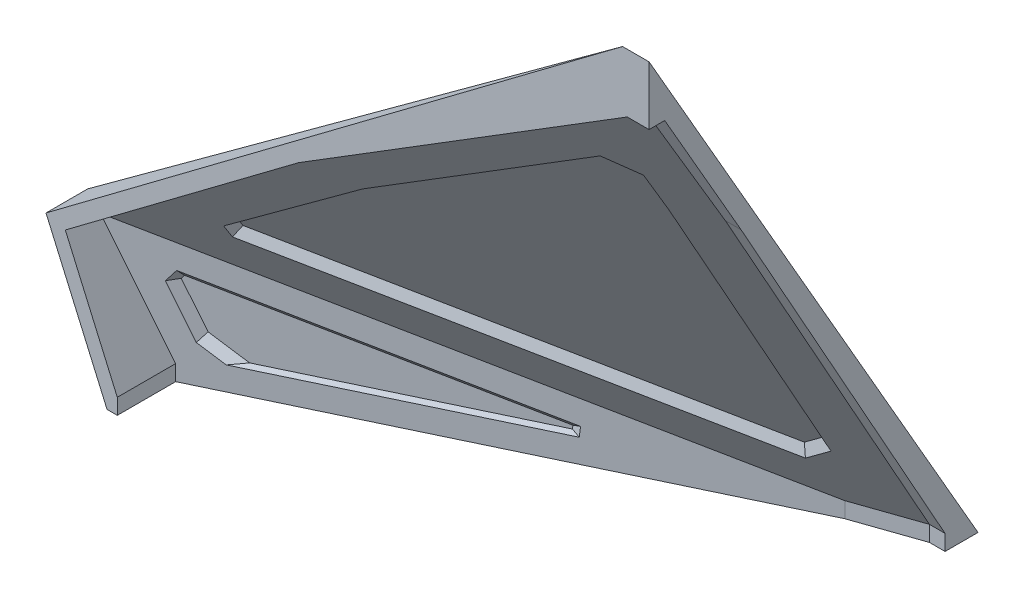
ISO-10303-21;
HEADER;
FILE_DESCRIPTION(('STEP AP214'),'2;1');
FILE_NAME('part.step','',(''),(''),'','','');
FILE_SCHEMA(('AUTOMOTIVE_DESIGN { 1 0 10303 214 1 1 1 1 }'));
ENDSEC;
DATA;
#1=APPLICATION_CONTEXT('core data for automotive mechanical design processes');
#2=APPLICATION_PROTOCOL_DEFINITION('international standard','automotive_design',2000,#1);
#3=PRODUCT_CONTEXT('',#1,'mechanical');
#4=PRODUCT('Part','Part','',(#3));
#5=PRODUCT_RELATED_PRODUCT_CATEGORY('part','',(#4));
#6=PRODUCT_DEFINITION_FORMATION('','',#4);
#7=PRODUCT_DEFINITION_CONTEXT('part definition',#1,'design');
#8=PRODUCT_DEFINITION('design','',#6,#7);
#9=PRODUCT_DEFINITION_SHAPE('','',#8);
#10=(LENGTH_UNIT() NAMED_UNIT(*) SI_UNIT(.MILLI.,.METRE.));
#11=(NAMED_UNIT(*) PLANE_ANGLE_UNIT() SI_UNIT($,.RADIAN.));
#12=(NAMED_UNIT(*) SI_UNIT($,.STERADIAN.) SOLID_ANGLE_UNIT());
#13=UNCERTAINTY_MEASURE_WITH_UNIT(LENGTH_MEASURE(1.E-05),#10,'distance_accuracy_value','');
#14=(GEOMETRIC_REPRESENTATION_CONTEXT(3) GLOBAL_UNCERTAINTY_ASSIGNED_CONTEXT((#13)) GLOBAL_UNIT_ASSIGNED_CONTEXT((#10,
#11,#12)) REPRESENTATION_CONTEXT('',''));
#15=CARTESIAN_POINT('',(0.,0.,0.));
#16=DIRECTION('',(0.,0.,1.));
#17=DIRECTION('',(1.,0.,0.));
#18=AXIS2_PLACEMENT_3D('',#15,#16,#17);
#19=CARTESIAN_POINT('',(-400.,0.,220.));
#20=DIRECTION('',(0.,1.,0.));
#21=DIRECTION('',(0.,0.,1.));
#22=AXIS2_PLACEMENT_3D('',#19,#20,#21);
#23=PLANE('',#22);
#24=DIRECTION('',(-0.90286051882393,0.,0.429933580392348));
#25=VECTOR('',#24,1.);
#26=CARTESIAN_POINT('',(-50.0889353936225,0.,44.9277819489755));
#27=LINE('',#26,#25);
#28=CARTESIAN_POINT('',(-50.0889353936225,0.,44.9277819489755));
#29=VERTEX_POINT('',#28);
#30=CARTESIAN_POINT('',(-339.485119824219,0.,182.735488820688));
#31=VERTEX_POINT('',#30);
#32=EDGE_CURVE('E411',#29,#31,#27,.T.);
#33=ORIENTED_EDGE('',*,*,#32,.T.);
#34=DIRECTION('',(0.,0.,1.));
#35=VECTOR('',#34,1.);
#36=CARTESIAN_POINT('',(-339.485119824219,0.,210.));
#37=LINE('',#36,#35);
#38=CARTESIAN_POINT('',(-339.485119824219,0.,220.));
#39=VERTEX_POINT('',#38);
#40=EDGE_CURVE('E388',#31,#39,#37,.T.);
#41=ORIENTED_EDGE('',*,*,#40,.T.);
#42=DIRECTION('',(1.,0.,0.));
#43=VECTOR('',#42,1.);
#44=CARTESIAN_POINT('',(-400.,0.,220.));
#45=LINE('',#44,#43);
#46=CARTESIAN_POINT('',(-346.027322404372,0.,220.));
#47=VERTEX_POINT('',#46);
#48=EDGE_CURVE('E341',#47,#39,#45,.T.);
#49=ORIENTED_EDGE('',*,*,#48,.F.);
#50=DIRECTION('',(0.,0.,-1.));
#51=VECTOR('',#50,1.);
#52=CARTESIAN_POINT('',(-346.027322404372,0.,220.));
#53=LINE('',#52,#51);
#54=CARTESIAN_POINT('',(-346.027322404372,0.,174.774915430653));
#55=VERTEX_POINT('',#54);
#56=EDGE_CURVE('E350',#47,#55,#53,.T.);
#57=ORIENTED_EDGE('',*,*,#56,.T.);
#58=DIRECTION('',(-0.90286051882393,0.,0.429933580392348));
#59=VECTOR('',#58,1.);
#60=CARTESIAN_POINT('',(0.,0.,10.));
#61=LINE('',#60,#59);
#62=CARTESIAN_POINT('',(0.,0.,10.));
#63=VERTEX_POINT('',#62);
#64=EDGE_CURVE('E347',#63,#55,#61,.T.);
#65=ORIENTED_EDGE('',*,*,#64,.F.);
#66=DIRECTION('',(0.,0.,-1.));
#67=VECTOR('',#66,1.);
#68=CARTESIAN_POINT('',(0.,0.,220.));
#69=LINE('',#68,#67);
#70=CARTESIAN_POINT('',(0.,0.,31.0264548673624));
#71=VERTEX_POINT('',#70);
#72=EDGE_CURVE('E334',#71,#63,#69,.T.);
#73=ORIENTED_EDGE('',*,*,#72,.F.);
#74=DIRECTION('',(1.,0.,0.));
#75=VECTOR('',#74,1.);
#76=CARTESIAN_POINT('',(-10.,0.,31.0264548673624));
#77=LINE('',#76,#75);
#78=CARTESIAN_POINT('',(-10.,0.,31.0264548673624));
#79=VERTEX_POINT('',#78);
#80=EDGE_CURVE('E368',#79,#71,#77,.T.);
#81=ORIENTED_EDGE('',*,*,#80,.F.);
#82=DIRECTION('',(-0.944808264227923,0.,0.327623784006318));
#83=VECTOR('',#82,1.);
#84=CARTESIAN_POINT('',(-10.,0.,31.0264548673624));
#85=LINE('',#84,#83);
#86=EDGE_CURVE('E415',#79,#29,#85,.T.);
#87=ORIENTED_EDGE('',*,*,#86,.T.);
#88=EDGE_LOOP('',(#33,#41,#49,#57,#65,#73,#81,#87));
#89=FACE_BOUND('',#88,.T.);
#90=ADVANCED_FACE('F33',(#89),#23,.F.);
#91=CARTESIAN_POINT('',(0.,300.,220.));
#92=DIRECTION('',(-1.,0.,0.));
#93=DIRECTION('',(0.,0.,1.));
#94=AXIS2_PLACEMENT_3D('',#91,#92,#93);
#95=PLANE('',#94);
#96=DIRECTION('',(0.,1.,0.));
#97=VECTOR('',#96,1.);
#98=CARTESIAN_POINT('',(0.,0.,220.));
#99=LINE('',#98,#97);
#100=CARTESIAN_POINT('',(0.,327.764744356418,220.));
#101=VERTEX_POINT('',#100);
#102=CARTESIAN_POINT('',(0.,365.217391304348,220.));
#103=VERTEX_POINT('',#102);
#104=EDGE_CURVE('E339',#101,#103,#99,.T.);
#105=ORIENTED_EDGE('',*,*,#104,.F.);
#106=DIRECTION('',(0.,0.,1.));
#107=VECTOR('',#106,1.);
#108=CARTESIAN_POINT('',(0.,327.764744356418,210.));
#109=LINE('',#108,#107);
#110=CARTESIAN_POINT('',(0.,327.764744356418,210.));
#111=VERTEX_POINT('',#110);
#112=EDGE_CURVE('E377',#111,#101,#109,.T.);
#113=ORIENTED_EDGE('',*,*,#112,.F.);
#114=DIRECTION('',(0.,0.866906303057535,0.498471124258083));
#115=VECTOR('',#114,1.);
#116=CARTESIAN_POINT('',(0.,243.013626516676,161.268107242148));
#117=LINE('',#116,#115);
#118=CARTESIAN_POINT('',(0.,243.013626516676,161.268107242148));
#119=VERTEX_POINT('',#118);
#120=EDGE_CURVE('E379',#119,#111,#117,.T.);
#121=ORIENTED_EDGE('',*,*,#120,.F.);
#122=DIRECTION('',(0.,0.872898563781906,0.487901729190916));
#123=VECTOR('',#122,1.);
#124=CARTESIAN_POINT('',(0.,10.,31.0264548673624));
#125=LINE('',#124,#123);
#126=CARTESIAN_POINT('',(0.,10.,31.0264548673624));
#127=VERTEX_POINT('',#126);
#128=EDGE_CURVE('E382',#127,#119,#125,.T.);
#129=ORIENTED_EDGE('',*,*,#128,.F.);
#130=DIRECTION('',(0.,1.,0.));
#131=VECTOR('',#130,1.);
#132=CARTESIAN_POINT('',(0.,0.,31.0264548673624));
#133=LINE('',#132,#131);
#134=EDGE_CURVE('E385',#71,#127,#133,.T.);
#135=ORIENTED_EDGE('',*,*,#134,.F.);
#136=ORIENTED_EDGE('',*,*,#72,.T.);
#137=DIRECTION('',(0.,-0.866906303057535,-0.498471124258083));
#138=VECTOR('',#137,1.);
#139=CARTESIAN_POINT('',(0.,400.,240.));
#140=LINE('',#139,#138);
#141=EDGE_CURVE('E344',#103,#63,#140,.T.);
#142=ORIENTED_EDGE('',*,*,#141,.F.);
#143=EDGE_LOOP('',(#105,#113,#121,#129,#135,#136,#142));
#144=FACE_BOUND('',#143,.T.);
#145=ADVANCED_FACE('F470',(#144),#95,.F.);
#146=CARTESIAN_POINT('',(0.,377.9,220.));
#147=DIRECTION('',(0.6,-0.8,0.));
#148=DIRECTION('',(0.8,0.6,0.));
#149=AXIS2_PLACEMENT_3D('',#146,#147,#148);
#150=PLANE('',#149);
#151=DIRECTION('',(-0.8,-0.6,0.));
#152=VECTOR('',#151,1.);
#153=CARTESIAN_POINT('',(0.,377.9,220.));
#154=LINE('',#153,#152);
#155=CARTESIAN_POINT('',(-16.9101449275364,365.217391304348,220.));
#156=VERTEX_POINT('',#155);
#157=CARTESIAN_POINT('',(-385.,89.15,220.));
#158=VERTEX_POINT('',#157);
#159=EDGE_CURVE('E336',#156,#158,#154,.T.);
#160=ORIENTED_EDGE('',*,*,#159,.F.);
#161=DIRECTION('',(-0.798659776221756,-0.598994832166317,-0.0578597691272618));
#162=VECTOR('',#161,1.);
#163=CARTESIAN_POINT('',(-0.0566109864408655,377.857541760169,221.220972448898));
#164=LINE('',#163,#162);
#165=CARTESIAN_POINT('',(-385.,89.15,193.333333333333));
#166=VERTEX_POINT('',#165);
#167=EDGE_CURVE('E358',#156,#166,#164,.T.);
#168=ORIENTED_EDGE('',*,*,#167,.T.);
#169=DIRECTION('',(0.,0.,1.));
#170=VECTOR('',#169,1.);
#171=CARTESIAN_POINT('',(-385.,89.15,9.99999999999995));
#172=LINE('',#171,#170);
#173=EDGE_CURVE('E353',#166,#158,#172,.T.);
#174=ORIENTED_EDGE('',*,*,#173,.T.);
#175=EDGE_LOOP('',(#160,#168,#174));
#176=FACE_BOUND('',#175,.T.);
#177=ADVANCED_FACE('F476',(#176),#150,.F.);
#178=CARTESIAN_POINT('',(0.,0.,220.));
#179=DIRECTION('',(0.,0.,1.));
#180=DIRECTION('',(1.,0.,0.));
#181=AXIS2_PLACEMENT_3D('',#178,#179,#180);
#182=PLANE('',#181);
#183=DIRECTION('',(0.,-1.,0.));
#184=VECTOR('',#183,1.);
#185=CARTESIAN_POINT('',(-339.485119824219,10.,220.));
#186=LINE('',#185,#184);
#187=CARTESIAN_POINT('',(-339.485119824219,10.,220.));
#188=VERTEX_POINT('',#187);
#189=EDGE_CURVE('E394',#188,#39,#186,.T.);
#190=ORIENTED_EDGE('',*,*,#189,.F.);
#191=DIRECTION('',(0.400556157771407,-0.916272210902092,0.));
#192=VECTOR('',#191,1.);
#193=CARTESIAN_POINT('',(-372.665748674206,85.9006884943456,220.));
#194=LINE('',#193,#192);
#195=CARTESIAN_POINT('',(-372.665748674206,85.9006884943456,220.));
#196=VERTEX_POINT('',#195);
#197=EDGE_CURVE('E399',#196,#188,#194,.T.);
#198=ORIENTED_EDGE('',*,*,#197,.F.);
#199=DIRECTION('',(-0.8,-0.6,0.));
#200=VECTOR('',#199,1.);
#201=CARTESIAN_POINT('',(-223.720300682486,197.609774488135,220.));
#202=LINE('',#201,#200);
#203=CARTESIAN_POINT('',(-223.720300682486,197.609774488135,220.));
#204=VERTEX_POINT('',#203);
#205=EDGE_CURVE('E402',#204,#196,#202,.T.);
#206=ORIENTED_EDGE('',*,*,#205,.F.);
#207=DIRECTION('',(-0.849755125087377,-0.527177605165219,0.));
#208=VECTOR('',#207,1.);
#209=CARTESIAN_POINT('',(-13.9241112815644,327.764744356418,220.));
#210=LINE('',#209,#208);
#211=CARTESIAN_POINT('',(-13.9241112815644,327.764744356418,220.));
#212=VERTEX_POINT('',#211);
#213=EDGE_CURVE('E405',#212,#204,#210,.T.);
#214=ORIENTED_EDGE('',*,*,#213,.F.);
#215=DIRECTION('',(1.,0.,0.));
#216=VECTOR('',#215,1.);
#217=CARTESIAN_POINT('',(-10.,327.764744356418,220.));
#218=LINE('',#217,#216);
#219=EDGE_CURVE('E367',#212,#101,#218,.T.);
#220=ORIENTED_EDGE('',*,*,#219,.T.);
#221=ORIENTED_EDGE('',*,*,#104,.T.);
#222=DIRECTION('',(1.,0.,0.));
#223=VECTOR('',#222,1.);
#224=CARTESIAN_POINT('',(0.,365.217391304348,220.));
#225=LINE('',#224,#223);
#226=EDGE_CURVE('E331',#156,#103,#225,.T.);
#227=ORIENTED_EDGE('',*,*,#226,.F.);
#228=ORIENTED_EDGE('',*,*,#159,.T.);
#229=DIRECTION('',(-0.400556157771407,0.916272210902092,0.));
#230=VECTOR('',#229,1.);
#231=CARTESIAN_POINT('',(-385.,89.15,220.));
#232=LINE('',#231,#230);
#233=EDGE_CURVE('E356',#47,#158,#232,.T.);
#234=ORIENTED_EDGE('',*,*,#233,.F.);
#235=ORIENTED_EDGE('',*,*,#48,.T.);
#236=EDGE_LOOP('',(#190,#198,#206,#214,#220,#221,#227,#228,#234,#235));
#237=FACE_BOUND('',#236,.T.);
#238=ADVANCED_FACE('F738',(#237),#182,.T.);
#239=CARTESIAN_POINT('',(-400.,400.,240.));
#240=DIRECTION('',(0.,-0.498471124258083,0.866906303057535));
#241=DIRECTION('',(0.,-0.866906303057535,-0.498471124258083));
#242=AXIS2_PLACEMENT_3D('',#239,#240,#241);
#243=PLANE('',#242);
#244=ORIENTED_EDGE('',*,*,#141,.T.);
#245=DIRECTION('',(-0.0401068417996536,0.866208787582418,0.498070052859891));
#246=VECTOR('',#245,1.);
#247=CARTESIAN_POINT('',(-19.1342668947673,413.252936019958,247.620438211476));
#248=LINE('',#247,#246);
#249=EDGE_CURVE('E361',#63,#156,#248,.T.);
#250=ORIENTED_EDGE('',*,*,#249,.T.);
#251=ORIENTED_EDGE('',*,*,#226,.T.);
#252=EDGE_LOOP('',(#244,#250,#251));
#253=FACE_BOUND('',#252,.T.);
#254=ADVANCED_FACE('F743',(#253),#243,.F.);
#255=CARTESIAN_POINT('',(0.,365.217391304348,10.));
#256=DIRECTION('',(0.429933580392348,0.,0.90286051882393));
#257=DIRECTION('',(0.90286051882393,0.,-0.429933580392348));
#258=AXIS2_PLACEMENT_3D('',#255,#256,#257);
#259=PLANE('',#258);
#260=DIRECTION('',(-0.393462595575842,0.900045687379739,0.187363140750401));
#261=VECTOR('',#260,1.);
#262=CARTESIAN_POINT('',(-409.646597923947,145.52909275103,205.069808535213));
#263=LINE('',#262,#261);
#264=EDGE_CURVE('E302',#55,#166,#263,.T.);
#265=ORIENTED_EDGE('',*,*,#264,.T.);
#266=DIRECTION('',(0.883753449505756,-0.204640571489451,-0.420834975955122));
#267=VECTOR('',#266,1.);
#268=CARTESIAN_POINT('',(-66.0502266124393,15.2944875389583,41.4524888630663));
#269=LINE('',#268,#267);
#270=EDGE_CURVE('E364',#166,#63,#269,.T.);
#271=ORIENTED_EDGE('',*,*,#270,.T.);
#272=ORIENTED_EDGE('',*,*,#64,.T.);
#273=EDGE_LOOP('',(#265,#271,#272));
#274=FACE_BOUND('',#273,.T.);
#275=ADVANCED_FACE('F772',(#274),#259,.F.);
#276=CARTESIAN_POINT('',(-385.,89.15,9.99999999999995));
#277=DIRECTION('',(0.916272210902092,0.400556157771407,0.));
#278=DIRECTION('',(-0.400556157771407,0.916272210902092,0.));
#279=AXIS2_PLACEMENT_3D('',#276,#277,#278);
#280=PLANE('',#279);
#281=ORIENTED_EDGE('',*,*,#233,.T.);
#282=ORIENTED_EDGE('',*,*,#173,.F.);
#283=ORIENTED_EDGE('',*,*,#264,.F.);
#284=ORIENTED_EDGE('',*,*,#56,.F.);
#285=EDGE_LOOP('',(#281,#282,#283,#284));
#286=FACE_BOUND('',#285,.T.);
#287=ADVANCED_FACE('F762',(#286),#280,.F.);
#288=CARTESIAN_POINT('',(2.42040337483263,-3.90143692067158,6.98000945884602));
#289=DIRECTION('',(0.289707503862804,-0.466978175422561,0.835464509051461));
#290=DIRECTION('',(0.,-0.872898563781906,-0.487901729190916));
#291=AXIS2_PLACEMENT_3D('',#288,#289,#290);
#292=PLANE('',#291);
#293=ORIENTED_EDGE('',*,*,#249,.F.);
#294=ORIENTED_EDGE('',*,*,#270,.F.);
#295=ORIENTED_EDGE('',*,*,#167,.F.);
#296=EDGE_LOOP('',(#293,#294,#295));
#297=FACE_BOUND('',#296,.T.);
#298=ADVANCED_FACE('F731',(#297),#292,.F.);
#299=CARTESIAN_POINT('',(-10.,327.764744356418,210.));
#300=DIRECTION('',(0.,1.,0.));
#301=DIRECTION('',(0.,0.,1.));
#302=AXIS2_PLACEMENT_3D('',#299,#300,#301);
#303=PLANE('',#302);
#304=ORIENTED_EDGE('',*,*,#112,.T.);
#305=ORIENTED_EDGE('',*,*,#219,.F.);
#306=DIRECTION('',(0.,0.,1.));
#307=VECTOR('',#306,1.);
#308=CARTESIAN_POINT('',(-13.9241112815644,327.764744356418,210.));
#309=LINE('',#308,#307);
#310=CARTESIAN_POINT('',(-13.9241112815644,327.764744356418,210.));
#311=VERTEX_POINT('',#310);
#312=EDGE_CURVE('E390',#311,#212,#309,.T.);
#313=ORIENTED_EDGE('',*,*,#312,.F.);
#314=DIRECTION('',(1.,0.,0.));
#315=VECTOR('',#314,1.);
#316=CARTESIAN_POINT('',(0.,327.764744356418,210.));
#317=LINE('',#316,#315);
#318=EDGE_CURVE('E313',#311,#111,#317,.T.);
#319=ORIENTED_EDGE('',*,*,#318,.T.);
#320=EDGE_LOOP('',(#304,#305,#313,#319));
#321=FACE_BOUND('',#320,.T.);
#322=ADVANCED_FACE('F695',(#321),#303,.F.);
#323=CARTESIAN_POINT('',(-10.,10.,31.0264548673624));
#324=DIRECTION('',(0.,0.487901729190916,-0.872898563781906));
#325=DIRECTION('',(0.,0.872898563781906,0.487901729190917));
#326=AXIS2_PLACEMENT_3D('',#323,#324,#325);
#327=PLANE('',#326);
#328=ORIENTED_EDGE('',*,*,#128,.T.);
#329=DIRECTION('',(1.,0.,0.));
#330=VECTOR('',#329,1.);
#331=CARTESIAN_POINT('',(-10.,243.013626516676,161.268107242148));
#332=LINE('',#331,#330);
#333=CARTESIAN_POINT('',(-10.,243.013626516676,161.268107242148));
#334=VERTEX_POINT('',#333);
#335=EDGE_CURVE('E373',#334,#119,#332,.T.);
#336=ORIENTED_EDGE('',*,*,#335,.F.);
#337=DIRECTION('',(0.,-0.872898563781906,-0.487901729190916));
#338=VECTOR('',#337,1.);
#339=CARTESIAN_POINT('',(-10.,-10.8333361350901,19.3817791319746));
#340=LINE('',#339,#338);
#341=CARTESIAN_POINT('',(-10.,10.,31.0264548673624));
#342=VERTEX_POINT('',#341);
#343=EDGE_CURVE('E324',#334,#342,#340,.T.);
#344=ORIENTED_EDGE('',*,*,#343,.T.);
#345=DIRECTION('',(1.,0.,0.));
#346=VECTOR('',#345,1.);
#347=CARTESIAN_POINT('',(-10.,10.,31.0264548673624));
#348=LINE('',#347,#346);
#349=EDGE_CURVE('E370',#342,#127,#348,.T.);
#350=ORIENTED_EDGE('',*,*,#349,.T.);
#351=EDGE_LOOP('',(#328,#336,#344,#350));
#352=FACE_BOUND('',#351,.T.);
#353=ADVANCED_FACE('F685',(#352),#327,.F.);
#354=CARTESIAN_POINT('',(-10.,0.,31.0264548673624));
#355=DIRECTION('',(0.,0.,-1.));
#356=DIRECTION('',(0.,1.,0.));
#357=AXIS2_PLACEMENT_3D('',#354,#355,#356);
#358=PLANE('',#357);
#359=ORIENTED_EDGE('',*,*,#134,.T.);
#360=ORIENTED_EDGE('',*,*,#349,.F.);
#361=DIRECTION('',(0.,1.,0.));
#362=VECTOR('',#361,1.);
#363=CARTESIAN_POINT('',(-10.,0.,31.0264548673624));
#364=LINE('',#363,#362);
#365=EDGE_CURVE('E371',#79,#342,#364,.T.);
#366=ORIENTED_EDGE('',*,*,#365,.F.);
#367=ORIENTED_EDGE('',*,*,#80,.T.);
#368=EDGE_LOOP('',(#359,#360,#366,#367));
#369=FACE_BOUND('',#368,.T.);
#370=ADVANCED_FACE('F485',(#369),#358,.F.);
#371=CARTESIAN_POINT('',(6.,369.9,220.));
#372=DIRECTION('',(0.6,-0.8,0.));
#373=DIRECTION('',(0.8,0.6,0.));
#374=AXIS2_PLACEMENT_3D('',#371,#372,#373);
#375=PLANE('',#374);
#376=DIRECTION('',(-0.798659776221756,-0.598994832166317,-0.0578597691272618));
#377=VECTOR('',#376,1.);
#378=CARTESIAN_POINT('',(5.69305590363511,369.669791927726,226.620098121854));
#379=LINE('',#378,#377);
#380=CARTESIAN_POINT('',(-223.720300682486,197.609774488135,210.));
#381=VERTEX_POINT('',#380);
#382=CARTESIAN_POINT('',(-372.665748674206,85.9006884943456,199.209486329552));
#383=VERTEX_POINT('',#382);
#384=EDGE_CURVE('E305',#381,#383,#379,.T.);
#385=ORIENTED_EDGE('',*,*,#384,.F.);
#386=DIRECTION('',(0.,0.,1.));
#387=VECTOR('',#386,1.);
#388=CARTESIAN_POINT('',(-223.720300682486,197.609774488135,210.));
#389=LINE('',#388,#387);
#390=EDGE_CURVE('E393',#381,#204,#389,.T.);
#391=ORIENTED_EDGE('',*,*,#390,.T.);
#392=ORIENTED_EDGE('',*,*,#205,.T.);
#393=DIRECTION('',(0.,0.,1.));
#394=VECTOR('',#393,1.);
#395=CARTESIAN_POINT('',(-372.665748674206,85.9006884943456,220.));
#396=LINE('',#395,#394);
#397=EDGE_CURVE('E308',#383,#196,#396,.T.);
#398=ORIENTED_EDGE('',*,*,#397,.F.);
#399=EDGE_LOOP('',(#385,#391,#392,#398));
#400=FACE_BOUND('',#399,.T.);
#401=ADVANCED_FACE('F481',(#400),#375,.T.);
#402=CARTESIAN_POINT('',(-400.,395.015288757419,248.669063030575));
#403=DIRECTION('',(0.,-0.498471124258083,0.866906303057535));
#404=DIRECTION('',(0.,-0.866906303057535,-0.498471124258083));
#405=AXIS2_PLACEMENT_3D('',#402,#403,#404);
#406=PLANE('',#405);
#407=DIRECTION('',(-0.0401068417996536,0.866208787582418,0.498070052859891));
#408=VECTOR('',#407,1.);
#409=CARTESIAN_POINT('',(-17.6539352452706,408.319735687742,256.319120015511));
#410=LINE('',#409,#408);
#411=EDGE_CURVE('E310',#334,#311,#410,.T.);
#412=ORIENTED_EDGE('',*,*,#411,.F.);
#413=ORIENTED_EDGE('',*,*,#335,.T.);
#414=ORIENTED_EDGE('',*,*,#120,.T.);
#415=ORIENTED_EDGE('',*,*,#318,.F.);
#416=EDGE_LOOP('',(#412,#413,#414,#415));
#417=FACE_BOUND('',#416,.T.);
#418=ADVANCED_FACE('F484',(#417),#406,.T.);
#419=CARTESIAN_POINT('',(4.29933580392348,365.217391304348,19.0286051882393));
#420=DIRECTION('',(0.429933580392348,0.,0.90286051882393));
#421=DIRECTION('',(0.90286051882393,0.,-0.429933580392348));
#422=AXIS2_PLACEMENT_3D('',#419,#420,#421);
#423=PLANE('',#422);
#424=DIRECTION('',(0.90286051882393,0.,-0.429933580392348));
#425=VECTOR('',#424,1.);
#426=CARTESIAN_POINT('',(-317.595395509706,15.,172.311810575682));
#427=LINE('',#426,#425);
#428=CARTESIAN_POINT('',(-317.595395509706,15.,172.311810575682));
#429=VERTEX_POINT('',#428);
#430=CARTESIAN_POINT('',(-164.946569123017,15.,99.6218932486873));
#431=VERTEX_POINT('',#430);
#432=EDGE_CURVE('E237',#429,#431,#427,.T.);
#433=ORIENTED_EDGE('',*,*,#432,.F.);
#434=DIRECTION('',(0.764983319958818,-0.531132963994991,-0.364277771408963));
#435=VECTOR('',#434,1.);
#436=CARTESIAN_POINT('',(-330.558626653704,24.0004568737974,178.484777787109));
#437=LINE('',#436,#435);
#438=CARTESIAN_POINT('',(-330.558626653704,24.0004568737974,178.484777787109));
#439=VERTEX_POINT('',#438);
#440=EDGE_CURVE('E443',#439,#429,#437,.T.);
#441=ORIENTED_EDGE('',*,*,#440,.F.);
#442=DIRECTION('',(0.39346259557584,-0.90004568737974,-0.1873631407504));
#443=VECTOR('',#442,1.);
#444=CARTESIAN_POINT('',(-343.949572120706,54.6322446295647,184.861418485682));
#445=LINE('',#444,#443);
#446=CARTESIAN_POINT('',(-343.949572120706,54.6322446295647,184.861418485682));
#447=VERTEX_POINT('',#446);
#448=EDGE_CURVE('E446',#447,#439,#445,.T.);
#449=ORIENTED_EDGE('',*,*,#448,.F.);
#450=DIRECTION('',(-0.555685886095597,-0.788158304242309,0.264612326712192));
#451=VECTOR('',#450,1.);
#452=CARTESIAN_POINT('',(-339.046663581407,61.5862957884676,182.526700133634));
#453=LINE('',#452,#451);
#454=CARTESIAN_POINT('',(-339.046663581407,61.5862957884676,182.526700133634));
#455=VERTEX_POINT('',#454);
#456=EDGE_CURVE('E227',#455,#447,#453,.T.);
#457=ORIENTED_EDGE('',*,*,#456,.F.);
#458=DIRECTION('',(-0.883753449505756,0.20464057148945,0.420834975955122));
#459=VECTOR('',#458,1.);
#460=CARTESIAN_POINT('',(-164.373357043472,21.1392171446835,99.3489351155705));
#461=LINE('',#460,#459);
#462=CARTESIAN_POINT('',(-164.373357043472,21.1392171446835,99.3489351155705));
#463=VERTEX_POINT('',#462);
#464=EDGE_CURVE('E219',#463,#455,#461,.T.);
#465=ORIENTED_EDGE('',*,*,#464,.F.);
#466=DIRECTION('',(0.0928736198223506,0.994695226162244,-0.0442255332487384));
#467=VECTOR('',#466,1.);
#468=CARTESIAN_POINT('',(-164.946569123017,15.,99.6218932486873));
#469=LINE('',#468,#467);
#470=EDGE_CURVE('E224',#431,#463,#469,.T.);
#471=ORIENTED_EDGE('',*,*,#470,.F.);
#472=EDGE_LOOP('',(#433,#441,#449,#457,#465,#471));
#473=FACE_BOUND('',#472,.T.);
#474=DIRECTION('',(-0.393462595575842,0.900045687379739,0.187363140750401));
#475=VECTOR('',#474,1.);
#476=CARTESIAN_POINT('',(-399.989012456393,148.402654396098,211.54686626458));
#477=LINE('',#476,#475);
#478=CARTESIAN_POINT('',(-339.485119824219,10.,182.735488820688));
#479=VERTEX_POINT('',#478);
#480=CARTESIAN_POINT('',(-372.079494496281,84.5596320623433,198.256619616908));
#481=VERTEX_POINT('',#480);
#482=EDGE_CURVE('E315',#479,#481,#477,.T.);
#483=ORIENTED_EDGE('',*,*,#482,.F.);
#484=DIRECTION('',(0.,1.,0.));
#485=VECTOR('',#484,1.);
#486=CARTESIAN_POINT('',(-339.485119824219,0.,182.735488820688));
#487=LINE('',#486,#485);
#488=EDGE_CURVE('E408',#31,#479,#487,.T.);
#489=ORIENTED_EDGE('',*,*,#488,.F.);
#490=ORIENTED_EDGE('',*,*,#32,.F.);
#491=DIRECTION('',(0.,1.,0.));
#492=VECTOR('',#491,1.);
#493=CARTESIAN_POINT('',(-50.0889353936225,0.,44.9277819489755));
#494=LINE('',#493,#492);
#495=CARTESIAN_POINT('',(-50.0889353936225,10.,44.9277819489755));
#496=VERTEX_POINT('',#495);
#497=EDGE_CURVE('E409',#29,#496,#494,.T.);
#498=ORIENTED_EDGE('',*,*,#497,.T.);
#499=DIRECTION('',(0.883753449505756,-0.204640571489451,-0.420834975955122));
#500=VECTOR('',#499,1.);
#501=CARTESIAN_POINT('',(-62.2200318572486,12.8090577915124,50.7044945507022));
#502=LINE('',#501,#500);
#503=EDGE_CURVE('E318',#481,#496,#502,.T.);
#504=ORIENTED_EDGE('',*,*,#503,.F.);
#505=EDGE_LOOP('',(#483,#489,#490,#498,#504));
#506=FACE_BOUND('',#505,.T.);
#507=ADVANCED_FACE('F222',(#473,#506),#423,.T.);
#508=CARTESIAN_POINT('',(-375.837277890979,93.1555615777141,9.99999999999995));
#509=DIRECTION('',(0.916272210902092,0.400556157771407,0.));
#510=DIRECTION('',(-0.400556157771407,0.916272210902092,0.));
#511=AXIS2_PLACEMENT_3D('',#508,#509,#510);
#512=PLANE('',#511);
#513=ORIENTED_EDGE('',*,*,#397,.T.);
#514=ORIENTED_EDGE('',*,*,#197,.T.);
#515=DIRECTION('',(0.,0.,-1.));
#516=VECTOR('',#515,1.);
#517=CARTESIAN_POINT('',(-339.485119824219,10.,220.));
#518=LINE('',#517,#516);
#519=EDGE_CURVE('E298',#188,#479,#518,.T.);
#520=ORIENTED_EDGE('',*,*,#519,.T.);
#521=ORIENTED_EDGE('',*,*,#482,.T.);
#522=DIRECTION('',(0.335683692560309,-0.767876446731706,-0.545602621972958));
#523=VECTOR('',#522,1.);
#524=CARTESIAN_POINT('',(-340.239470996602,11.7255783068254,146.505519726988));
#525=LINE('',#524,#523);
#526=EDGE_CURVE('E321',#383,#481,#525,.T.);
#527=ORIENTED_EDGE('',*,*,#526,.F.);
#528=EDGE_LOOP('',(#513,#514,#520,#521,#527));
#529=FACE_BOUND('',#528,.T.);
#530=ADVANCED_FACE('F492',(#529),#512,.T.);
#531=CARTESIAN_POINT('',(5.31747841346068,-8.57121867489719,15.3346545493606));
#532=DIRECTION('',(0.289707503862804,-0.466978175422561,0.835464509051461));
#533=DIRECTION('',(0.,-0.872898563781906,-0.487901729190916));
#534=AXIS2_PLACEMENT_3D('',#531,#532,#533);
#535=PLANE('',#534);
#536=DIRECTION('',(-0.0401068417996545,0.866208787582418,0.498070052859892));
#537=VECTOR('',#536,1.);
#538=CARTESIAN_POINT('',(-38.7134568797459,238.22425413481,168.54785578647));
#539=LINE('',#538,#537);
#540=CARTESIAN_POINT('',(-38.7134568797459,238.22425413481,168.54785578647));
#541=VERTEX_POINT('',#540);
#542=CARTESIAN_POINT('',(-39.9216795663431,264.318881922131,183.55226676418));
#543=VERTEX_POINT('',#542);
#544=EDGE_CURVE('E439',#541,#543,#539,.T.);
#545=ORIENTED_EDGE('',*,*,#544,.F.);
#546=DIRECTION('',(0.,0.872898563781906,0.487901729190916));
#547=VECTOR('',#546,1.);
#548=CARTESIAN_POINT('',(-38.7134568797459,53.1846610670199,65.121018840597));
#549=LINE('',#548,#547);
#550=CARTESIAN_POINT('',(-38.7134568797459,53.1846610670199,65.121018840597));
#551=VERTEX_POINT('',#550);
#552=EDGE_CURVE('E418',#551,#541,#549,.T.);
#553=ORIENTED_EDGE('',*,*,#552,.F.);
#554=DIRECTION('',(0.796178526563549,0.602037439248781,0.060420820764591));
#555=VECTOR('',#554,1.);
#556=CARTESIAN_POINT('',(-56.388525869861,39.8195012211708,63.7796837758811));
#557=LINE('',#556,#555);
#558=CARTESIAN_POINT('',(-56.388525869861,39.8195012211708,63.7796837758811));
#559=VERTEX_POINT('',#558);
#560=EDGE_CURVE('E421',#559,#551,#557,.T.);
#561=ORIENTED_EDGE('',*,*,#560,.F.);
#562=DIRECTION('',(0.883753449505756,-0.204640571489451,-0.420834975955122));
#563=VECTOR('',#562,1.);
#564=CARTESIAN_POINT('',(-304.190433476651,97.2001247618082,181.780592160067));
#565=LINE('',#564,#563);
#566=CARTESIAN_POINT('',(-304.190433476651,97.2001247618082,181.780592160067));
#567=VERTEX_POINT('',#566);
#568=EDGE_CURVE('E424',#567,#559,#565,.T.);
#569=ORIENTED_EDGE('',*,*,#568,.F.);
#570=DIRECTION('',(0.0905959860641419,-0.855599940870579,-0.509648024121871));
#571=VECTOR('',#570,1.);
#572=CARTESIAN_POINT('',(-305.041370209491,105.236478798366,186.567539610891));
#573=LINE('',#572,#571);
#574=CARTESIAN_POINT('',(-305.041370209491,105.236478798366,186.567539610891));
#575=VERTEX_POINT('',#574);
#576=EDGE_CURVE('E427',#575,#567,#573,.T.);
#577=ORIENTED_EDGE('',*,*,#576,.F.);
#578=DIRECTION('',(-0.798659776221756,-0.598994832166317,-0.057859769127262));
#579=VECTOR('',#578,1.);
#580=CARTESIAN_POINT('',(-209.161395472747,177.146459850924,193.513667821378));
#581=LINE('',#580,#579);
#582=CARTESIAN_POINT('',(-209.161395472747,177.146459850924,193.513667821378));
#583=VERTEX_POINT('',#582);
#584=EDGE_CURVE('E430',#583,#575,#581,.T.);
#585=ORIENTED_EDGE('',*,*,#584,.F.);
#586=DIRECTION('',(-0.849755125087377,-0.527177605165219,0.));
#587=VECTOR('',#586,1.);
#588=CARTESIAN_POINT('',(-57.7189189040837,271.099505570476,193.513667821378));
#589=LINE('',#588,#587);
#590=CARTESIAN_POINT('',(-57.7189189040837,271.099505570476,193.513667821378));
#591=VERTEX_POINT('',#590);
#592=EDGE_CURVE('E433',#591,#583,#589,.T.);
#593=ORIENTED_EDGE('',*,*,#592,.F.);
#594=DIRECTION('',(-0.828049024945117,0.315480884084344,0.463472355232544));
#595=VECTOR('',#594,1.);
#596=CARTESIAN_POINT('',(-39.9216795663431,264.318881922131,183.55226676418));
#597=LINE('',#596,#595);
#598=EDGE_CURVE('E436',#543,#591,#597,.T.);
#599=ORIENTED_EDGE('',*,*,#598,.F.);
#600=EDGE_LOOP('',(#545,#553,#561,#569,#577,#585,#593,#599));
#601=FACE_BOUND('',#600,.T.);
#602=ORIENTED_EDGE('',*,*,#411,.T.);
#603=DIRECTION('',(0.849755125087377,0.527177605165219,0.));
#604=VECTOR('',#603,1.);
#605=CARTESIAN_POINT('',(-150.699122523191,242.911213328415,210.));
#606=LINE('',#605,#604);
#607=EDGE_CURVE('E297',#381,#311,#606,.T.);
#608=ORIENTED_EDGE('',*,*,#607,.F.);
#609=ORIENTED_EDGE('',*,*,#384,.T.);
#610=ORIENTED_EDGE('',*,*,#526,.T.);
#611=ORIENTED_EDGE('',*,*,#503,.T.);
#612=DIRECTION('',(0.944808264227923,0.,-0.327623784006318));
#613=VECTOR('',#612,1.);
#614=CARTESIAN_POINT('',(-416.633620508099,10.,172.031620147028));
#615=LINE('',#614,#613);
#616=EDGE_CURVE('E301',#496,#342,#615,.T.);
#617=ORIENTED_EDGE('',*,*,#616,.T.);
#618=ORIENTED_EDGE('',*,*,#343,.F.);
#619=EDGE_LOOP('',(#602,#608,#609,#610,#611,#617,#618));
#620=FACE_BOUND('',#619,.T.);
#621=ADVANCED_FACE('F495',(#601,#620),#535,.T.);
#622=CARTESIAN_POINT('',(-339.485119824219,10.,210.));
#623=DIRECTION('',(-1.,0.,0.));
#624=DIRECTION('',(0.,0.,1.));
#625=AXIS2_PLACEMENT_3D('',#622,#623,#624);
#626=PLANE('',#625);
#627=ORIENTED_EDGE('',*,*,#189,.T.);
#628=ORIENTED_EDGE('',*,*,#40,.F.);
#629=ORIENTED_EDGE('',*,*,#488,.T.);
#630=ORIENTED_EDGE('',*,*,#519,.F.);
#631=EDGE_LOOP('',(#627,#628,#629,#630));
#632=FACE_BOUND('',#631,.T.);
#633=ADVANCED_FACE('F499',(#632),#626,.F.);
#634=CARTESIAN_POINT('',(-13.9241112815644,327.764744356418,210.));
#635=DIRECTION('',(-0.527177605165219,0.849755125087377,0.));
#636=DIRECTION('',(-0.849755125087377,-0.527177605165219,0.));
#637=AXIS2_PLACEMENT_3D('',#634,#635,#636);
#638=PLANE('',#637);
#639=ORIENTED_EDGE('',*,*,#213,.T.);
#640=ORIENTED_EDGE('',*,*,#390,.F.);
#641=ORIENTED_EDGE('',*,*,#607,.T.);
#642=ORIENTED_EDGE('',*,*,#312,.T.);
#643=EDGE_LOOP('',(#639,#640,#641,#642));
#644=FACE_BOUND('',#643,.T.);
#645=ADVANCED_FACE('F659',(#644),#638,.F.);
#646=CARTESIAN_POINT('',(-10.,0.,31.0264548673624));
#647=DIRECTION('',(-0.327623784006318,0.,-0.944808264227923));
#648=DIRECTION('',(-0.944808264227923,0.,0.327623784006318));
#649=AXIS2_PLACEMENT_3D('',#646,#647,#648);
#650=PLANE('',#649);
#651=ORIENTED_EDGE('',*,*,#616,.F.);
#652=ORIENTED_EDGE('',*,*,#497,.F.);
#653=ORIENTED_EDGE('',*,*,#86,.F.);
#654=ORIENTED_EDGE('',*,*,#365,.T.);
#655=EDGE_LOOP('',(#651,#652,#653,#654));
#656=FACE_BOUND('',#655,.T.);
#657=ADVANCED_FACE('F631',(#656),#650,.F.);
#658=CARTESIAN_POINT('',(3.86894089414663,-6.23632779778437,11.1573320041033));
#659=DIRECTION('',(-0.289707503862804,0.466978175422562,-0.835464509051461));
#660=DIRECTION('',(0.,0.872898563781905,0.487901729190917));
#661=AXIS2_PLACEMENT_3D('',#658,#659,#660);
#662=PLANE('',#661);
#663=DIRECTION('',(0.796178526563549,0.602037439248781,0.0604208207645915));
#664=VECTOR('',#663,1.);
#665=CARTESIAN_POINT('',(-42.8179749903137,58.757924627371,63.6747600923496));
#666=LINE('',#665,#664);
#667=CARTESIAN_POINT('',(-58.3634484250584,47.0030773081917,62.495036911224));
#668=VERTEX_POINT('',#667);
#669=CARTESIAN_POINT('',(-44.9475705456841,57.1476121007012,63.5131482087593));
#670=VERTEX_POINT('',#669);
#671=EDGE_CURVE('E283',#668,#670,#666,.T.);
#672=ORIENTED_EDGE('',*,*,#671,.T.);
#673=DIRECTION('',(0.,0.872898563781905,0.487901729190917));
#674=VECTOR('',#673,1.);
#675=CARTESIAN_POINT('',(-44.947570545684,239.852401051451,165.634959561407));
#676=LINE('',#675,#674);
#677=CARTESIAN_POINT('',(-44.947570545684,239.76091628161,165.583824665266));
#678=VERTEX_POINT('',#677);
#679=EDGE_CURVE('E280',#670,#678,#676,.T.);
#680=ORIENTED_EDGE('',*,*,#679,.T.);
#681=DIRECTION('',(-0.0401068417996545,0.866208787582418,0.498070052859892));
#682=VECTOR('',#681,1.);
#683=CARTESIAN_POINT('',(-46.1515898055107,265.764760425961,180.536035048268));
#684=LINE('',#683,#682);
#685=CARTESIAN_POINT('',(-46.0415768126634,263.388751324357,179.169829814846));
#686=VERTEX_POINT('',#685);
#687=EDGE_CURVE('E295',#678,#686,#684,.T.);
#688=ORIENTED_EDGE('',*,*,#687,.T.);
#689=DIRECTION('',(-0.828049024945117,0.315480884084344,0.463472355232544));
#690=VECTOR('',#689,1.);
#691=CARTESIAN_POINT('',(-61.5674792071073,269.304011491388,187.859927059197));
#692=LINE('',#691,#690);
#693=CARTESIAN_POINT('',(-59.2961422638107,268.438648010074,186.588623246351));
#694=VERTEX_POINT('',#693);
#695=EDGE_CURVE('E293',#686,#694,#692,.T.);
#696=ORIENTED_EDGE('',*,*,#695,.T.);
#697=DIRECTION('',(-0.849755125087377,-0.527177605165219,0.));
#698=VECTOR('',#697,1.);
#699=CARTESIAN_POINT('',(-208.40774209665,175.931649486061,186.588623246351));
#700=LINE('',#699,#698);
#701=CARTESIAN_POINT('',(-208.183448790438,176.070798288501,186.588623246351));
#702=VERTEX_POINT('',#701);
#703=EDGE_CURVE('E291',#694,#702,#700,.T.);
#704=ORIENTED_EDGE('',*,*,#703,.T.);
#705=DIRECTION('',(-0.798659776221756,-0.598994832166317,-0.0578597691272628));
#706=VECTOR('',#705,1.);
#707=CARTESIAN_POINT('',(-303.852616864817,104.318922232717,179.657767151948));
#708=LINE('',#707,#706);
#709=CARTESIAN_POINT('',(-301.453696736129,106.118112329233,179.83155950876));
#710=VERTEX_POINT('',#709);
#711=EDGE_CURVE('E289',#702,#710,#708,.T.);
#712=ORIENTED_EDGE('',*,*,#711,.T.);
#713=DIRECTION('',(0.0905959860641417,-0.855599940870579,-0.509648024121871));
#714=VECTOR('',#713,1.);
#715=CARTESIAN_POINT('',(-300.874881551185,100.651708578601,176.5754327403));
#716=LINE('',#715,#714);
#717=CARTESIAN_POINT('',(-301.147003099081,103.221658864527,178.106253422663));
#718=VERTEX_POINT('',#717);
#719=EDGE_CURVE('E287',#710,#718,#716,.T.);
#720=ORIENTED_EDGE('',*,*,#719,.T.);
#721=DIRECTION('',(0.883753449505756,-0.204640571489451,-0.420834975955122));
#722=VECTOR('',#721,1.);
#723=CARTESIAN_POINT('',(-55.9996099700903,46.4557105594633,61.3693995517154));
#724=LINE('',#723,#722);
#725=EDGE_CURVE('E285',#718,#668,#724,.T.);
#726=ORIENTED_EDGE('',*,*,#725,.T.);
#727=EDGE_LOOP('',(#672,#680,#688,#696,#704,#712,#720,#726));
#728=FACE_BOUND('',#727,.T.);
#729=ADVANCED_FACE('F622',(#728),#662,.F.);
#730=CARTESIAN_POINT('',(-319.745063411668,15.,167.797507981562));
#731=DIRECTION('',(0.,-1.,0.));
#732=DIRECTION('',(1.,0.,0.));
#733=AXIS2_PLACEMENT_3D('',#730,#731,#732);
#734=PLANE('',#733);
#735=DIRECTION('',(0.90286051882393,0.,-0.429933580392348));
#736=VECTOR('',#735,1.);
#737=CARTESIAN_POINT('',(-319.745063411668,15.,167.797507981562));
#738=LINE('',#737,#736);
#739=CARTESIAN_POINT('',(-311.245680206067,15.,163.750182645562));
#740=VERTEX_POINT('',#739);
#741=CARTESIAN_POINT('',(-171.634614686182,15.,97.2687228741879));
#742=VERTEX_POINT('',#741);
#743=EDGE_CURVE('E442',#740,#742,#738,.T.);
#744=ORIENTED_EDGE('',*,*,#743,.F.);
#745=DIRECTION('',(-0.59569804996807,0.,0.803208461897806));
#746=VECTOR('',#745,1.);
#747=CARTESIAN_POINT('',(-174.971578188657,14.9999999999999,-19.9947731819341));
#748=LINE('',#747,#746);
#749=EDGE_CURVE('E11',#740,#429,#748,.T.);
#750=ORIENTED_EDGE('',*,*,#749,.T.);
#751=ORIENTED_EDGE('',*,*,#432,.T.);
#752=DIRECTION('',(-0.943313752815888,0.,-0.33190234067931));
#753=VECTOR('',#752,1.);
#754=CARTESIAN_POINT('',(-171.268504365684,15.,97.3975377801059));
#755=LINE('',#754,#753);
#756=EDGE_CURVE('E42',#431,#742,#755,.T.);
#757=ORIENTED_EDGE('',*,*,#756,.T.);
#758=EDGE_LOOP('',(#744,#750,#751,#757));
#759=FACE_BOUND('',#758,.T.);
#760=ADVANCED_FACE('F456',(#759),#734,.F.);
#761=CARTESIAN_POINT('',(6.03136845649039,0.,12.6658737586298));
#762=DIRECTION('',(0.429933580392348,0.,0.90286051882393));
#763=DIRECTION('',(0.90286051882393,0.,-0.429933580392348));
#764=AXIS2_PLACEMENT_3D('',#761,#762,#763);
#765=PLANE('',#764);
#766=DIRECTION('',(0.39346259557584,-0.90004568737974,-0.1873631407504));
#767=VECTOR('',#766,1.);
#768=CARTESIAN_POINT('',(-255.813152449039,-140.423910694661,137.353740856501));
#769=LINE('',#768,#767);
#770=CARTESIAN_POINT('',(-340.811088269414,54.0088674944473,177.828948390013));
#771=VERTEX_POINT('',#770);
#772=CARTESIAN_POINT('',(-329.210858418502,27.4733417104865,172.305029413388));
#773=VERTEX_POINT('',#772);
#774=EDGE_CURVE('E50',#771,#773,#769,.T.);
#775=ORIENTED_EDGE('',*,*,#774,.T.);
#776=DIRECTION('',(0.764983319958819,-0.531132963994991,-0.364277771408961));
#777=VECTOR('',#776,1.);
#778=CARTESIAN_POINT('',(-77.3785751808732,-147.375473336655,52.3848945383267));
#779=LINE('',#778,#777);
#780=EDGE_CURVE('E273',#773,#740,#779,.T.);
#781=ORIENTED_EDGE('',*,*,#780,.T.);
#782=ORIENTED_EDGE('',*,*,#743,.T.);
#783=DIRECTION('',(0.0928736198223506,0.994695226162244,-0.0442255332487384));
#784=VECTOR('',#783,1.);
#785=CARTESIAN_POINT('',(-171.140372793709,20.2934304913779,97.0333695920579));
#786=LINE('',#785,#784);
#787=CARTESIAN_POINT('',(-171.432202368031,17.1678768090057,97.1723360560208));
#788=VERTEX_POINT('',#787);
#789=EDGE_CURVE('E278',#742,#788,#786,.T.);
#790=ORIENTED_EDGE('',*,*,#789,.T.);
#791=DIRECTION('',(-0.883753449505756,0.20464057148945,0.420834975955122));
#792=VECTOR('',#791,1.);
#793=CARTESIAN_POINT('',(1.70443261901124,-22.9233725652666,14.7263193955246));
#794=LINE('',#793,#792);
#795=CARTESIAN_POINT('',(-339.368513081786,56.0549471989572,177.142007824476));
#796=VERTEX_POINT('',#795);
#797=EDGE_CURVE('E240',#788,#796,#794,.T.);
#798=ORIENTED_EDGE('',*,*,#797,.T.);
#799=DIRECTION('',(-0.555685886095598,-0.788158304242309,0.264612326712189));
#800=VECTOR('',#799,1.);
#801=CARTESIAN_POINT('',(-233.079095286487,206.810777758297,126.527999350524));
#802=LINE('',#801,#800);
#803=EDGE_CURVE('E55',#796,#771,#802,.T.);
#804=ORIENTED_EDGE('',*,*,#803,.T.);
#805=EDGE_LOOP('',(#775,#781,#782,#790,#798,#804));
#806=FACE_BOUND('',#805,.T.);
#807=ADVANCED_FACE('F453',(#806),#765,.T.);
#808=CARTESIAN_POINT('',(-168.245449434679,206.024297805321,189.481974697028));
#809=DIRECTION('',(0.577823391319477,-0.790168962953331,0.204335847147083));
#810=DIRECTION('',(0.798659776221756,0.598994832166317,0.0578597691272628));
#811=AXIS2_PLACEMENT_3D('',#808,#809,#810);
#812=PLANE('',#811);
#813=DIRECTION('',(0.138206291505817,-0.152015644766077,-0.978667596650958));
#814=VECTOR('',#813,1.);
#815=CARTESIAN_POINT('',(-208.441251491552,176.354360226277,188.414177981667));
#816=LINE('',#815,#814);
#817=EDGE_CURVE('E256',#583,#702,#816,.T.);
#818=ORIENTED_EDGE('',*,*,#817,.F.);
#819=ORIENTED_EDGE('',*,*,#584,.T.);
#820=DIRECTION('',(0.466987823363617,0.114757412189538,-0.87678566889387));
#821=VECTOR('',#820,1.);
#822=CARTESIAN_POINT('',(-263.156546577384,115.529239614729,107.927345439952));
#823=LINE('',#822,#821);
#824=EDGE_CURVE('E253',#710,#575,#823,.F.);
#825=ORIENTED_EDGE('',*,*,#824,.F.);
#826=ORIENTED_EDGE('',*,*,#711,.F.);
#827=EDGE_LOOP('',(#818,#819,#825,#826));
#828=FACE_BOUND('',#827,.T.);
#829=ADVANCED_FACE('F528',(#828),#812,.T.);
#830=CARTESIAN_POINT('',(-282.450650109427,-73.3490614002503,72.929856835778));
#831=DIRECTION('',(0.878598131058686,-0.172279204477191,0.445404535007099));
#832=DIRECTION('',(-0.0905959860641418,0.855599940870579,0.509648024121871));
#833=AXIS2_PLACEMENT_3D('',#830,#831,#832);
#834=PLANE('',#833);
#835=ORIENTED_EDGE('',*,*,#824,.T.);
#836=ORIENTED_EDGE('',*,*,#576,.T.);
#837=DIRECTION('',(0.396146677821387,0.783790142781161,-0.478268566529482));
#838=VECTOR('',#837,1.);
#839=CARTESIAN_POINT('',(-245.045986513838,214.219494417099,110.375399460615));
#840=LINE('',#839,#838);
#841=EDGE_CURVE('E259',#718,#567,#840,.F.);
#842=ORIENTED_EDGE('',*,*,#841,.F.);
#843=ORIENTED_EDGE('',*,*,#719,.F.);
#844=EDGE_LOOP('',(#835,#836,#842,#843));
#845=FACE_BOUND('',#844,.T.);
#846=ADVANCED_FACE('F524',(#845),#834,.T.);
#847=CARTESIAN_POINT('',(-136.732323774625,220.3981955117,186.588623246351));
#848=DIRECTION('',(0.516290963664555,-0.832206998384842,0.202176043777737));
#849=DIRECTION('',(0.849755125087377,0.527177605165219,0.));
#850=AXIS2_PLACEMENT_3D('',#847,#848,#849);
#851=PLANE('',#850);
#852=ORIENTED_EDGE('',*,*,#817,.T.);
#853=ORIENTED_EDGE('',*,*,#703,.F.);
#854=DIRECTION('',(-0.207954592189347,-0.350830175976473,-0.913056994503453));
#855=VECTOR('',#854,1.);
#856=CARTESIAN_POINT('',(-66.1497537370066,256.876250210143,156.496775659197));
#857=LINE('',#856,#855);
#858=EDGE_CURVE('E262',#591,#694,#857,.T.);
#859=ORIENTED_EDGE('',*,*,#858,.F.);
#860=ORIENTED_EDGE('',*,*,#592,.T.);
#861=EDGE_LOOP('',(#852,#853,#859,#860));
#862=FACE_BOUND('',#861,.T.);
#863=ADVANCED_FACE('F520',(#862),#851,.T.);
#864=CARTESIAN_POINT('',(18.9629747862005,29.097491258104,25.6729306201484));
#865=DIRECTION('',(0.464709295091874,0.278094855881226,0.840659575683055));
#866=DIRECTION('',(-0.883753449505756,0.204640571489451,0.420834975955122));
#867=AXIS2_PLACEMENT_3D('',#864,#865,#866);
#868=PLANE('',#867);
#869=ORIENTED_EDGE('',*,*,#841,.T.);
#870=ORIENTED_EDGE('',*,*,#568,.T.);
#871=DIRECTION('',(-0.261231309236087,0.950201809823376,-0.169925641629449));
#872=VECTOR('',#871,1.);
#873=CARTESIAN_POINT('',(-59.6938167390884,51.8421541532282,61.6296594416317));
#874=LINE('',#873,#872);
#875=EDGE_CURVE('E265',#668,#559,#874,.F.);
#876=ORIENTED_EDGE('',*,*,#875,.F.);
#877=ORIENTED_EDGE('',*,*,#725,.F.);
#878=EDGE_LOOP('',(#869,#870,#876,#877));
#879=FACE_BOUND('',#878,.T.);
#880=ADVANCED_FACE('F516',(#879),#868,.T.);
#881=CARTESIAN_POINT('',(123.094940249081,198.948921886574,84.5014013076906));
#882=DIRECTION('',(-0.13456033653065,-0.914328076795503,0.38196555318012));
#883=DIRECTION('',(0.828049024945117,-0.315480884084344,-0.463472355232545));
#884=AXIS2_PLACEMENT_3D('',#881,#882,#883);
#885=PLANE('',#884);
#886=ORIENTED_EDGE('',*,*,#858,.T.);
#887=ORIENTED_EDGE('',*,*,#695,.F.);
#888=DIRECTION('',(-0.80689949730367,-0.122636358350997,-0.577817899395208));
#889=VECTOR('',#888,1.);
#890=CARTESIAN_POINT('',(13.5660192203048,272.448192471573,221.854620229092));
#891=LINE('',#890,#889);
#892=EDGE_CURVE('E268',#543,#686,#891,.T.);
#893=ORIENTED_EDGE('',*,*,#892,.F.);
#894=ORIENTED_EDGE('',*,*,#598,.T.);
#895=EDGE_LOOP('',(#886,#887,#893,#894));
#896=FACE_BOUND('',#895,.T.);
#897=ADVANCED_FACE('F512',(#896),#885,.T.);
#898=CARTESIAN_POINT('',(-46.9031666174206,55.668870823522,63.3647408908072));
#899=DIRECTION('',(-0.170758236813068,0.127771622358012,0.976993365934741));
#900=DIRECTION('',(-0.796178526563549,-0.602037439248781,-0.0604208207645915));
#901=AXIS2_PLACEMENT_3D('',#898,#899,#900);
#902=PLANE('',#901);
#903=ORIENTED_EDGE('',*,*,#875,.T.);
#904=ORIENTED_EDGE('',*,*,#560,.T.);
#905=DIRECTION('',(-0.824612423709391,0.524196194044487,-0.212679808193912));
#906=VECTOR('',#905,1.);
#907=CARTESIAN_POINT('',(-21.3530480370728,42.1488580876647,69.5985264752973));
#908=LINE('',#907,#906);
#909=EDGE_CURVE('E243',#670,#551,#908,.F.);
#910=ORIENTED_EDGE('',*,*,#909,.F.);
#911=ORIENTED_EDGE('',*,*,#671,.F.);
#912=EDGE_LOOP('',(#903,#904,#910,#911));
#913=FACE_BOUND('',#912,.T.);
#914=ADVANCED_FACE('F508',(#913),#902,.T.);
#915=CARTESIAN_POINT('',(-33.2380547406407,-13.1357226342729,20.1682572886329));
#916=DIRECTION('',(-0.47133407417576,-0.455928770048852,0.754965659591627));
#917=DIRECTION('',(0.0401068417996545,-0.866208787582418,-0.498070052859892));
#918=AXIS2_PLACEMENT_3D('',#915,#916,#917);
#919=PLANE('',#918);
#920=ORIENTED_EDGE('',*,*,#892,.T.);
#921=ORIENTED_EDGE('',*,*,#687,.F.);
#922=DIRECTION('',(0.881539984418113,-0.217292978206146,0.419131265231331));
#923=VECTOR('',#922,1.);
#924=CARTESIAN_POINT('',(-48.7372766003665,240.695050330778,163.781995682316));
#925=LINE('',#924,#923);
#926=EDGE_CURVE('E241',#541,#678,#925,.F.);
#927=ORIENTED_EDGE('',*,*,#926,.F.);
#928=ORIENTED_EDGE('',*,*,#544,.T.);
#929=EDGE_LOOP('',(#920,#921,#927,#928));
#930=FACE_BOUND('',#929,.T.);
#931=ADVANCED_FACE('F504',(#930),#919,.T.);
#932=CARTESIAN_POINT('',(-44.9475705456841,-13.4456529812759,24.0554408280711));
#933=DIRECTION('',(-0.471928528490507,-0.430152123909784,0.769579504854883));
#934=DIRECTION('',(0.,-0.872898563781905,-0.487901729190917));
#935=AXIS2_PLACEMENT_3D('',#932,#933,#934);
#936=PLANE('',#935);
#937=ORIENTED_EDGE('',*,*,#909,.T.);
#938=ORIENTED_EDGE('',*,*,#552,.T.);
#939=ORIENTED_EDGE('',*,*,#926,.T.);
#940=ORIENTED_EDGE('',*,*,#679,.F.);
#941=EDGE_LOOP('',(#937,#938,#939,#940));
#942=FACE_BOUND('',#941,.T.);
#943=ADVANCED_FACE('F501',(#942),#936,.T.);
#944=CARTESIAN_POINT('',(-171.140372793709,20.2934304913779,97.0333695920579));
#945=DIRECTION('',(0.331023177847788,-0.0727372224175551,-0.940815046756019));
#946=DIRECTION('',(0.0928736198223506,0.994695226162244,-0.0442255332487384));
#947=AXIS2_PLACEMENT_3D('',#944,#945,#946);
#948=PLANE('',#947);
#949=ORIENTED_EDGE('',*,*,#756,.F.);
#950=ORIENTED_EDGE('',*,*,#470,.T.);
#951=DIRECTION('',(-0.841673242485653,-0.473529415032593,-0.259530433634627));
#952=VECTOR('',#951,1.);
#953=CARTESIAN_POINT('',(-82.7679554779733,67.0508086224999,124.512008130313));
#954=LINE('',#953,#952);
#955=EDGE_CURVE('E37',#788,#463,#954,.F.);
#956=ORIENTED_EDGE('',*,*,#955,.F.);
#957=ORIENTED_EDGE('',*,*,#789,.F.);
#958=EDGE_LOOP('',(#949,#950,#956,#957));
#959=FACE_BOUND('',#958,.T.);
#960=ADVANCED_FACE('F35',(#959),#948,.F.);
#961=CARTESIAN_POINT('',(1.70443261901129,-22.9233725652664,14.7263193955246));
#962=DIRECTION('',(-0.173362563030123,0.692142411827386,-0.700631360623685));
#963=DIRECTION('',(-0.883753449505756,0.20464057148945,0.420834975955122));
#964=AXIS2_PLACEMENT_3D('',#961,#962,#963);
#965=PLANE('',#964);
#966=ORIENTED_EDGE('',*,*,#955,.T.);
#967=ORIENTED_EDGE('',*,*,#464,.T.);
#968=DIRECTION('',(-0.0416568427318573,-0.715920074496916,-0.696938415059712));
#969=VECTOR('',#968,1.);
#970=CARTESIAN_POINT('',(-336.157521989921,111.239469859353,230.863386968355));
#971=LINE('',#970,#969);
#972=EDGE_CURVE('E242',#796,#455,#971,.F.);
#973=ORIENTED_EDGE('',*,*,#972,.F.);
#974=ORIENTED_EDGE('',*,*,#797,.F.);
#975=EDGE_LOOP('',(#966,#967,#973,#974));
#976=FACE_BOUND('',#975,.T.);
#977=ADVANCED_FACE('F239',(#976),#965,.F.);
#978=CARTESIAN_POINT('',(-233.079095286488,206.810777758297,126.527999350524));
#979=DIRECTION('',(-0.807184025275801,0.435204829622718,-0.398811616697178));
#980=DIRECTION('',(-0.555685886095598,-0.788158304242309,0.264612326712189));
#981=AXIS2_PLACEMENT_3D('',#978,#979,#980);
#982=PLANE('',#981);
#983=ORIENTED_EDGE('',*,*,#972,.T.);
#984=ORIENTED_EDGE('',*,*,#456,.T.);
#985=DIRECTION('',(0.406212618182364,-0.0806834351136728,-0.910209586923631));
#986=VECTOR('',#985,1.);
#987=CARTESIAN_POINT('',(-305.447980521632,46.9849177654779,98.5900516775678));
#988=LINE('',#987,#986);
#989=EDGE_CURVE('E245',#771,#447,#988,.F.);
#990=ORIENTED_EDGE('',*,*,#989,.F.);
#991=ORIENTED_EDGE('',*,*,#803,.F.);
#992=EDGE_LOOP('',(#983,#984,#990,#991));
#993=FACE_BOUND('',#992,.T.);
#994=ADVANCED_FACE('F461',(#993),#982,.F.);
#995=CARTESIAN_POINT('',(-255.813152449039,-140.423910694661,137.353740856501));
#996=DIRECTION('',(-0.878615033630581,-0.308153987990689,-0.36479685081394));
#997=DIRECTION('',(0.39346259557584,-0.90004568737974,-0.1873631407504));
#998=AXIS2_PLACEMENT_3D('',#995,#996,#997);
#999=PLANE('',#998);
#1000=ORIENTED_EDGE('',*,*,#989,.T.);
#1001=ORIENTED_EDGE('',*,*,#448,.T.);
#1002=DIRECTION('',(0.186782075666762,0.481293906033689,-0.856427832467191));
#1003=VECTOR('',#1002,1.);
#1004=CARTESIAN_POINT('',(-316.96037707906,59.0399788923744,116.134472668233));
#1005=LINE('',#1004,#1003);
#1006=EDGE_CURVE('E248',#773,#439,#1005,.F.);
#1007=ORIENTED_EDGE('',*,*,#1006,.F.);
#1008=ORIENTED_EDGE('',*,*,#774,.F.);
#1009=EDGE_LOOP('',(#1000,#1001,#1007,#1008));
#1010=FACE_BOUND('',#1009,.T.);
#1011=ADVANCED_FACE('F460',(#1010),#999,.F.);
#1012=CARTESIAN_POINT('',(-77.3785751808733,-147.375473336655,52.3848945383268));
#1013=DIRECTION('',(-0.643094217186853,-0.599123432423518,-0.476949620549058));
#1014=DIRECTION('',(0.764983319958819,-0.531132963994991,-0.364277771408961));
#1015=AXIS2_PLACEMENT_3D('',#1012,#1013,#1014);
#1016=PLANE('',#1015);
#1017=ORIENTED_EDGE('',*,*,#1006,.T.);
#1018=ORIENTED_EDGE('',*,*,#440,.T.);
#1019=ORIENTED_EDGE('',*,*,#749,.F.);
#1020=ORIENTED_EDGE('',*,*,#780,.F.);
#1021=EDGE_LOOP('',(#1017,#1018,#1019,#1020));
#1022=FACE_BOUND('',#1021,.T.);
#1023=ADVANCED_FACE('F458',(#1022),#1016,.F.);
#1024=CLOSED_SHELL('',(#90,#145,#177,#238,#254,#275,#287,#298,#322,#353,#370,#401,#418,#507,
#530,#621,#633,#645,#657,#729,#760,#807,#829,#846,#863,#880,#897,#914,#931,#943,#960,#977,#994,
#1011,#1023));
#1025=MANIFOLD_SOLID_BREP('B2',#1024);
#1026=ADVANCED_BREP_SHAPE_REPRESENTATION('',(#18,#1025),#14);
#1027=SHAPE_DEFINITION_REPRESENTATION(#9,#1026);
ENDSEC;
END-ISO-10303-21;
